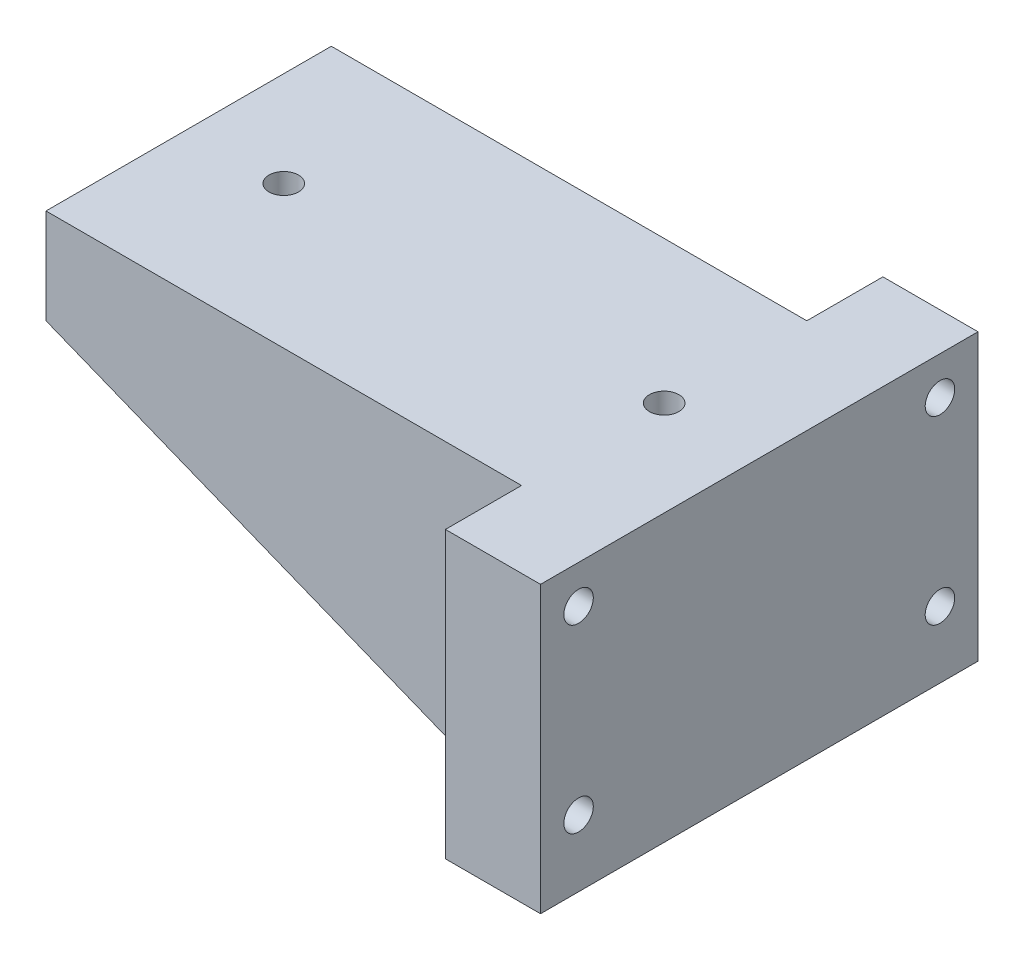
ISO-10303-21;
HEADER;
FILE_DESCRIPTION(('STEP AP214'),'2;1');
FILE_NAME('part.step','',(''),(''),'','','');
FILE_SCHEMA(('AUTOMOTIVE_DESIGN { 1 0 10303 214 1 1 1 1 }'));
ENDSEC;
DATA;
#1=APPLICATION_CONTEXT('core data for automotive mechanical design processes');
#2=APPLICATION_PROTOCOL_DEFINITION('international standard','automotive_design',2000,#1);
#3=PRODUCT_CONTEXT('',#1,'mechanical');
#4=PRODUCT('Part','Part','',(#3));
#5=PRODUCT_RELATED_PRODUCT_CATEGORY('part','',(#4));
#6=PRODUCT_DEFINITION_FORMATION('','',#4);
#7=PRODUCT_DEFINITION_CONTEXT('part definition',#1,'design');
#8=PRODUCT_DEFINITION('design','',#6,#7);
#9=PRODUCT_DEFINITION_SHAPE('','',#8);
#10=(LENGTH_UNIT() NAMED_UNIT(*) SI_UNIT(.MILLI.,.METRE.));
#11=(NAMED_UNIT(*) PLANE_ANGLE_UNIT() SI_UNIT($,.RADIAN.));
#12=(NAMED_UNIT(*) SI_UNIT($,.STERADIAN.) SOLID_ANGLE_UNIT());
#13=UNCERTAINTY_MEASURE_WITH_UNIT(LENGTH_MEASURE(1.E-05),#10,'distance_accuracy_value','');
#14=(GEOMETRIC_REPRESENTATION_CONTEXT(3) GLOBAL_UNCERTAINTY_ASSIGNED_CONTEXT((#13)) GLOBAL_UNIT_ASSIGNED_CONTEXT((#10,
#11,#12)) REPRESENTATION_CONTEXT('',''));
#15=CARTESIAN_POINT('',(0.,0.,0.));
#16=DIRECTION('',(0.,0.,1.));
#17=DIRECTION('',(1.,0.,0.));
#18=AXIS2_PLACEMENT_3D('',#15,#16,#17);
#19=CARTESIAN_POINT('',(0.,0.,0.));
#20=DIRECTION('',(0.,-1.,0.));
#21=DIRECTION('',(0.,0.,-1.));
#22=AXIS2_PLACEMENT_3D('',#19,#20,#21);
#23=PLANE('',#22);
#24=CARTESIAN_POINT('',(20.,0.,0.));
#25=DIRECTION('',(0.,1.,0.));
#26=DIRECTION('',(0.,0.,1.));
#27=AXIS2_PLACEMENT_3D('',#24,#25,#26);
#28=CIRCLE('',#27,1.55);
#29=CARTESIAN_POINT('',(20.,0.,1.55));
#30=VERTEX_POINT('',#29);
#31=EDGE_CURVE('E291',#30,#30,#28,.T.);
#32=ORIENTED_EDGE('',*,*,#31,.T.);
#33=EDGE_LOOP('',(#32));
#34=FACE_BOUND('',#33,.T.);
#35=CARTESIAN_POINT('',(-20.,0.,0.));
#36=DIRECTION('',(0.,1.,0.));
#37=DIRECTION('',(0.,0.,1.));
#38=AXIS2_PLACEMENT_3D('',#35,#36,#37);
#39=CIRCLE('',#38,1.55);
#40=CARTESIAN_POINT('',(-20.,0.,1.55));
#41=VERTEX_POINT('',#40);
#42=EDGE_CURVE('E280',#41,#41,#39,.T.);
#43=ORIENTED_EDGE('',*,*,#42,.T.);
#44=EDGE_LOOP('',(#43));
#45=FACE_BOUND('',#44,.T.);
#46=DIRECTION('',(0.,0.,-1.));
#47=VECTOR('',#46,1.);
#48=CARTESIAN_POINT('',(20.,0.,0.));
#49=LINE('',#48,#47);
#50=CARTESIAN_POINT('',(20.,0.,9.));
#51=VERTEX_POINT('',#50);
#52=CARTESIAN_POINT('',(20.,0.,5.));
#53=VERTEX_POINT('',#52);
#54=EDGE_CURVE('E261',#51,#53,#49,.T.);
#55=ORIENTED_EDGE('',*,*,#54,.F.);
#56=DIRECTION('',(-1.,0.,0.));
#57=VECTOR('',#56,1.);
#58=CARTESIAN_POINT('',(20.,0.,9.));
#59=LINE('',#58,#57);
#60=CARTESIAN_POINT('',(-30.,0.,9.));
#61=VERTEX_POINT('',#60);
#62=EDGE_CURVE('E151',#51,#61,#59,.T.);
#63=ORIENTED_EDGE('',*,*,#62,.T.);
#64=DIRECTION('',(0.,0.,1.));
#65=VECTOR('',#64,1.);
#66=CARTESIAN_POINT('',(-30.,0.,15.));
#67=LINE('',#66,#65);
#68=CARTESIAN_POINT('',(-30.,0.,-9.));
#69=VERTEX_POINT('',#68);
#70=EDGE_CURVE('E62',#69,#61,#67,.T.);
#71=ORIENTED_EDGE('',*,*,#70,.F.);
#72=DIRECTION('',(1.,0.,0.));
#73=VECTOR('',#72,1.);
#74=CARTESIAN_POINT('',(20.,0.,-9.));
#75=LINE('',#74,#73);
#76=CARTESIAN_POINT('',(20.,0.,-9.));
#77=VERTEX_POINT('',#76);
#78=EDGE_CURVE('E190',#69,#77,#75,.T.);
#79=ORIENTED_EDGE('',*,*,#78,.T.);
#80=DIRECTION('',(0.,0.,-1.));
#81=VECTOR('',#80,1.);
#82=CARTESIAN_POINT('',(20.,0.,0.));
#83=LINE('',#82,#81);
#84=CARTESIAN_POINT('',(20.,0.,-5.));
#85=VERTEX_POINT('',#84);
#86=EDGE_CURVE('E215',#85,#77,#83,.T.);
#87=ORIENTED_EDGE('',*,*,#86,.F.);
#88=DIRECTION('',(1.,0.,0.));
#89=VECTOR('',#88,1.);
#90=CARTESIAN_POINT('',(20.,0.,-5.));
#91=LINE('',#90,#89);
#92=CARTESIAN_POINT('',(24.,0.,-5.));
#93=VERTEX_POINT('',#92);
#94=EDGE_CURVE('E233',#85,#93,#91,.T.);
#95=ORIENTED_EDGE('',*,*,#94,.T.);
#96=DIRECTION('',(0.,0.,-1.));
#97=VECTOR('',#96,1.);
#98=CARTESIAN_POINT('',(24.,0.,0.));
#99=LINE('',#98,#97);
#100=CARTESIAN_POINT('',(24.,0.,5.));
#101=VERTEX_POINT('',#100);
#102=EDGE_CURVE('E199',#101,#93,#99,.T.);
#103=ORIENTED_EDGE('',*,*,#102,.F.);
#104=DIRECTION('',(1.,0.,0.));
#105=VECTOR('',#104,1.);
#106=CARTESIAN_POINT('',(20.,0.,5.));
#107=LINE('',#106,#105);
#108=EDGE_CURVE('E268',#53,#101,#107,.T.);
#109=ORIENTED_EDGE('',*,*,#108,.F.);
#110=EDGE_LOOP('',(#55,#63,#71,#79,#87,#95,#103,#109));
#111=FACE_BOUND('',#110,.T.);
#112=ADVANCED_FACE('F39',(#34,#45,#111),#23,.T.);
#113=CARTESIAN_POINT('',(20.,0.,0.));
#114=DIRECTION('',(1.,0.,0.));
#115=DIRECTION('',(0.,0.,-1.));
#116=AXIS2_PLACEMENT_3D('',#113,#114,#115);
#117=PLANE('',#116);
#118=DIRECTION('',(0.,1.,0.));
#119=VECTOR('',#118,1.);
#120=CARTESIAN_POINT('',(20.,-20.,9.));
#121=LINE('',#120,#119);
#122=CARTESIAN_POINT('',(20.,-20.,9.));
#123=VERTEX_POINT('',#122);
#124=EDGE_CURVE('E147',#123,#51,#121,.T.);
#125=ORIENTED_EDGE('',*,*,#124,.T.);
#126=ORIENTED_EDGE('',*,*,#54,.T.);
#127=DIRECTION('',(0.,-1.,0.));
#128=VECTOR('',#127,1.);
#129=CARTESIAN_POINT('',(20.,0.,5.));
#130=LINE('',#129,#128);
#131=CARTESIAN_POINT('',(20.,-20.,5.));
#132=VERTEX_POINT('',#131);
#133=EDGE_CURVE('E170',#53,#132,#130,.T.);
#134=ORIENTED_EDGE('',*,*,#133,.T.);
#135=DIRECTION('',(0.,0.,-1.));
#136=VECTOR('',#135,1.);
#137=CARTESIAN_POINT('',(20.,-20.,0.));
#138=LINE('',#137,#136);
#139=EDGE_CURVE('E167',#123,#132,#138,.T.);
#140=ORIENTED_EDGE('',*,*,#139,.F.);
#141=EDGE_LOOP('',(#125,#126,#134,#140));
#142=FACE_BOUND('',#141,.T.);
#143=ADVANCED_FACE('F168',(#142),#117,.F.);
#144=CARTESIAN_POINT('',(20.,0.,0.));
#145=DIRECTION('',(1.,0.,0.));
#146=DIRECTION('',(0.,0.,-1.));
#147=AXIS2_PLACEMENT_3D('',#144,#145,#146);
#148=PLANE('',#147);
#149=CARTESIAN_POINT('',(20.,6.,-19.));
#150=DIRECTION('',(1.,0.,0.));
#151=DIRECTION('',(0.,0.,-1.));
#152=AXIS2_PLACEMENT_3D('',#149,#150,#151);
#153=CIRCLE('',#152,1.55);
#154=CARTESIAN_POINT('',(20.,6.,-20.55));
#155=VERTEX_POINT('',#154);
#156=EDGE_CURVE('E211',#155,#155,#153,.T.);
#157=ORIENTED_EDGE('',*,*,#156,.T.);
#158=EDGE_LOOP('',(#157));
#159=FACE_BOUND('',#158,.T.);
#160=CARTESIAN_POINT('',(20.,-13.,-19.));
#161=DIRECTION('',(1.,0.,0.));
#162=DIRECTION('',(0.,0.,-1.));
#163=AXIS2_PLACEMENT_3D('',#160,#161,#162);
#164=CIRCLE('',#163,1.55);
#165=CARTESIAN_POINT('',(20.,-13.,-20.55));
#166=VERTEX_POINT('',#165);
#167=EDGE_CURVE('E208',#166,#166,#164,.T.);
#168=ORIENTED_EDGE('',*,*,#167,.T.);
#169=EDGE_LOOP('',(#168));
#170=FACE_BOUND('',#169,.T.);
#171=DIRECTION('',(0.,0.,-1.));
#172=VECTOR('',#171,1.);
#173=CARTESIAN_POINT('',(20.,-20.,0.));
#174=LINE('',#173,#172);
#175=CARTESIAN_POINT('',(20.,-20.,-15.));
#176=VERTEX_POINT('',#175);
#177=CARTESIAN_POINT('',(20.,-20.,-23.));
#178=VERTEX_POINT('',#177);
#179=EDGE_CURVE('E221',#176,#178,#174,.T.);
#180=ORIENTED_EDGE('',*,*,#179,.F.);
#181=DIRECTION('',(0.,1.,0.));
#182=VECTOR('',#181,1.);
#183=CARTESIAN_POINT('',(20.,0.,-15.));
#184=LINE('',#183,#182);
#185=CARTESIAN_POINT('',(20.,10.,-15.));
#186=VERTEX_POINT('',#185);
#187=EDGE_CURVE('E230',#176,#186,#184,.T.);
#188=ORIENTED_EDGE('',*,*,#187,.T.);
#189=DIRECTION('',(0.,0.,-1.));
#190=VECTOR('',#189,1.);
#191=CARTESIAN_POINT('',(20.,10.,0.));
#192=LINE('',#191,#190);
#193=CARTESIAN_POINT('',(20.,10.,-23.));
#194=VERTEX_POINT('',#193);
#195=EDGE_CURVE('E228',#186,#194,#192,.T.);
#196=ORIENTED_EDGE('',*,*,#195,.T.);
#197=DIRECTION('',(0.,-1.,0.));
#198=VECTOR('',#197,1.);
#199=CARTESIAN_POINT('',(20.,0.,-23.));
#200=LINE('',#199,#198);
#201=EDGE_CURVE('E225',#194,#178,#200,.T.);
#202=ORIENTED_EDGE('',*,*,#201,.T.);
#203=EDGE_LOOP('',(#180,#188,#196,#202));
#204=FACE_BOUND('',#203,.T.);
#205=ADVANCED_FACE('F353',(#159,#170,#204),#148,.F.);
#206=CARTESIAN_POINT('',(20.,0.,5.));
#207=DIRECTION('',(0.,0.,1.));
#208=DIRECTION('',(0.,-1.,0.));
#209=AXIS2_PLACEMENT_3D('',#206,#207,#208);
#210=PLANE('',#209);
#211=DIRECTION('',(0.,-1.,0.));
#212=VECTOR('',#211,1.);
#213=CARTESIAN_POINT('',(24.,0.,5.));
#214=LINE('',#213,#212);
#215=CARTESIAN_POINT('',(24.,-20.,5.));
#216=VERTEX_POINT('',#215);
#217=EDGE_CURVE('E201',#101,#216,#214,.T.);
#218=ORIENTED_EDGE('',*,*,#217,.T.);
#219=DIRECTION('',(1.,0.,0.));
#220=VECTOR('',#219,1.);
#221=CARTESIAN_POINT('',(20.,-20.,5.));
#222=LINE('',#221,#220);
#223=EDGE_CURVE('E278',#132,#216,#222,.T.);
#224=ORIENTED_EDGE('',*,*,#223,.F.);
#225=ORIENTED_EDGE('',*,*,#133,.F.);
#226=ORIENTED_EDGE('',*,*,#108,.T.);
#227=EDGE_LOOP('',(#218,#224,#225,#226));
#228=FACE_BOUND('',#227,.T.);
#229=ADVANCED_FACE('F340',(#228),#210,.F.);
#230=CARTESIAN_POINT('',(20.,0.,-5.));
#231=DIRECTION('',(0.,0.,1.));
#232=DIRECTION('',(0.,-1.,0.));
#233=AXIS2_PLACEMENT_3D('',#230,#231,#232);
#234=PLANE('',#233);
#235=DIRECTION('',(1.,0.,0.));
#236=VECTOR('',#235,1.);
#237=CARTESIAN_POINT('',(20.,-20.,-5.));
#238=LINE('',#237,#236);
#239=CARTESIAN_POINT('',(20.,-20.,-5.));
#240=VERTEX_POINT('',#239);
#241=CARTESIAN_POINT('',(24.,-20.,-5.));
#242=VERTEX_POINT('',#241);
#243=EDGE_CURVE('E248',#240,#242,#238,.T.);
#244=ORIENTED_EDGE('',*,*,#243,.T.);
#245=DIRECTION('',(0.,-1.,0.));
#246=VECTOR('',#245,1.);
#247=CARTESIAN_POINT('',(24.,0.,-5.));
#248=LINE('',#247,#246);
#249=EDGE_CURVE('E197',#93,#242,#248,.T.);
#250=ORIENTED_EDGE('',*,*,#249,.F.);
#251=ORIENTED_EDGE('',*,*,#94,.F.);
#252=DIRECTION('',(0.,-1.,0.));
#253=VECTOR('',#252,1.);
#254=CARTESIAN_POINT('',(20.,0.,-5.));
#255=LINE('',#254,#253);
#256=EDGE_CURVE('E218',#85,#240,#255,.T.);
#257=ORIENTED_EDGE('',*,*,#256,.T.);
#258=EDGE_LOOP('',(#244,#250,#251,#257));
#259=FACE_BOUND('',#258,.T.);
#260=ADVANCED_FACE('F334',(#259),#234,.T.);
#261=CARTESIAN_POINT('',(-30.,10.,-15.));
#262=DIRECTION('',(0.,0.,1.));
#263=DIRECTION('',(1.,0.,0.));
#264=AXIS2_PLACEMENT_3D('',#261,#262,#263);
#265=PLANE('',#264);
#266=ORIENTED_EDGE('',*,*,#187,.F.);
#267=DIRECTION('',(-0.928476690885259,0.371390676354104,0.));
#268=VECTOR('',#267,1.);
#269=CARTESIAN_POINT('',(20.,-20.,-15.));
#270=LINE('',#269,#268);
#271=CARTESIAN_POINT('',(-30.,0.,-15.));
#272=VERTEX_POINT('',#271);
#273=EDGE_CURVE('E180',#176,#272,#270,.T.);
#274=ORIENTED_EDGE('',*,*,#273,.T.);
#275=DIRECTION('',(0.,-1.,0.));
#276=VECTOR('',#275,1.);
#277=CARTESIAN_POINT('',(-30.,10.,-15.));
#278=LINE('',#277,#276);
#279=CARTESIAN_POINT('',(-30.,10.,-15.));
#280=VERTEX_POINT('',#279);
#281=EDGE_CURVE('E11',#280,#272,#278,.T.);
#282=ORIENTED_EDGE('',*,*,#281,.F.);
#283=DIRECTION('',(-1.,0.,0.));
#284=VECTOR('',#283,1.);
#285=CARTESIAN_POINT('',(-30.,10.,-15.));
#286=LINE('',#285,#284);
#287=EDGE_CURVE('E301',#186,#280,#286,.T.);
#288=ORIENTED_EDGE('',*,*,#287,.F.);
#289=EDGE_LOOP('',(#266,#274,#282,#288));
#290=FACE_BOUND('',#289,.T.);
#291=ADVANCED_FACE('F370',(#290),#265,.F.);
#292=CARTESIAN_POINT('',(-30.,10.,15.));
#293=DIRECTION('',(0.,0.,-1.));
#294=DIRECTION('',(-1.,0.,0.));
#295=AXIS2_PLACEMENT_3D('',#292,#293,#294);
#296=PLANE('',#295);
#297=DIRECTION('',(0.,-1.,0.));
#298=VECTOR('',#297,1.);
#299=CARTESIAN_POINT('',(20.,0.,15.));
#300=LINE('',#299,#298);
#301=CARTESIAN_POINT('',(20.,10.,15.));
#302=VERTEX_POINT('',#301);
#303=CARTESIAN_POINT('',(20.,-20.,15.));
#304=VERTEX_POINT('',#303);
#305=EDGE_CURVE('E54',#302,#304,#300,.T.);
#306=ORIENTED_EDGE('',*,*,#305,.F.);
#307=DIRECTION('',(1.,0.,0.));
#308=VECTOR('',#307,1.);
#309=CARTESIAN_POINT('',(-30.,10.,15.));
#310=LINE('',#309,#308);
#311=CARTESIAN_POINT('',(-30.,10.,15.));
#312=VERTEX_POINT('',#311);
#313=EDGE_CURVE('E306',#312,#302,#310,.T.);
#314=ORIENTED_EDGE('',*,*,#313,.F.);
#315=DIRECTION('',(0.,-1.,0.));
#316=VECTOR('',#315,1.);
#317=CARTESIAN_POINT('',(-30.,10.,15.));
#318=LINE('',#317,#316);
#319=CARTESIAN_POINT('',(-30.,0.,15.));
#320=VERTEX_POINT('',#319);
#321=EDGE_CURVE('E47',#312,#320,#318,.T.);
#322=ORIENTED_EDGE('',*,*,#321,.T.);
#323=DIRECTION('',(0.928476690885259,-0.371390676354104,0.));
#324=VECTOR('',#323,1.);
#325=CARTESIAN_POINT('',(-30.,0.,15.));
#326=LINE('',#325,#324);
#327=EDGE_CURVE('E164',#320,#304,#326,.T.);
#328=ORIENTED_EDGE('',*,*,#327,.T.);
#329=EDGE_LOOP('',(#306,#314,#322,#328));
#330=FACE_BOUND('',#329,.T.);
#331=ADVANCED_FACE('F313',(#330),#296,.F.);
#332=CARTESIAN_POINT('',(0.,10.,0.));
#333=DIRECTION('',(0.,-1.,0.));
#334=DIRECTION('',(0.,0.,-1.));
#335=AXIS2_PLACEMENT_3D('',#332,#333,#334);
#336=PLANE('',#335);
#337=DIRECTION('',(0.,0.,-1.));
#338=VECTOR('',#337,1.);
#339=CARTESIAN_POINT('',(30.,10.,15.));
#340=LINE('',#339,#338);
#341=CARTESIAN_POINT('',(30.,10.,23.));
#342=VERTEX_POINT('',#341);
#343=CARTESIAN_POINT('',(30.,10.,-23.));
#344=VERTEX_POINT('',#343);
#345=EDGE_CURVE('E299',#342,#344,#340,.T.);
#346=ORIENTED_EDGE('',*,*,#345,.T.);
#347=DIRECTION('',(1.,0.,0.));
#348=VECTOR('',#347,1.);
#349=CARTESIAN_POINT('',(20.,10.,-23.));
#350=LINE('',#349,#348);
#351=EDGE_CURVE('E241',#194,#344,#350,.T.);
#352=ORIENTED_EDGE('',*,*,#351,.F.);
#353=ORIENTED_EDGE('',*,*,#195,.F.);
#354=ORIENTED_EDGE('',*,*,#287,.T.);
#355=DIRECTION('',(0.,0.,1.));
#356=VECTOR('',#355,1.);
#357=CARTESIAN_POINT('',(-30.,10.,15.));
#358=LINE('',#357,#356);
#359=EDGE_CURVE('E304',#280,#312,#358,.T.);
#360=ORIENTED_EDGE('',*,*,#359,.T.);
#361=ORIENTED_EDGE('',*,*,#313,.T.);
#362=DIRECTION('',(0.,0.,-1.));
#363=VECTOR('',#362,1.);
#364=CARTESIAN_POINT('',(20.,10.,0.));
#365=LINE('',#364,#363);
#366=CARTESIAN_POINT('',(20.,10.,23.));
#367=VERTEX_POINT('',#366);
#368=EDGE_CURVE('E264',#367,#302,#365,.T.);
#369=ORIENTED_EDGE('',*,*,#368,.F.);
#370=DIRECTION('',(1.,0.,0.));
#371=VECTOR('',#370,1.);
#372=CARTESIAN_POINT('',(20.,10.,23.));
#373=LINE('',#372,#371);
#374=EDGE_CURVE('E283',#367,#342,#373,.T.);
#375=ORIENTED_EDGE('',*,*,#374,.T.);
#376=EDGE_LOOP('',(#346,#352,#353,#354,#360,#361,#369,#375));
#377=FACE_BOUND('',#376,.T.);
#378=CARTESIAN_POINT('',(20.,10.,0.));
#379=DIRECTION('',(0.,1.,0.));
#380=DIRECTION('',(0.,0.,1.));
#381=AXIS2_PLACEMENT_3D('',#378,#379,#380);
#382=CIRCLE('',#381,1.55);
#383=CARTESIAN_POINT('',(20.,10.,1.55));
#384=VERTEX_POINT('',#383);
#385=EDGE_CURVE('E294',#384,#384,#382,.T.);
#386=ORIENTED_EDGE('',*,*,#385,.F.);
#387=EDGE_LOOP('',(#386));
#388=FACE_BOUND('',#387,.T.);
#389=CARTESIAN_POINT('',(-20.,10.,0.));
#390=DIRECTION('',(0.,1.,0.));
#391=DIRECTION('',(0.,0.,1.));
#392=AXIS2_PLACEMENT_3D('',#389,#390,#391);
#393=CIRCLE('',#392,1.55);
#394=CARTESIAN_POINT('',(-20.,10.,1.55));
#395=VERTEX_POINT('',#394);
#396=EDGE_CURVE('E288',#395,#395,#393,.T.);
#397=ORIENTED_EDGE('',*,*,#396,.F.);
#398=EDGE_LOOP('',(#397));
#399=FACE_BOUND('',#398,.T.);
#400=ADVANCED_FACE('F366',(#377,#388,#399),#336,.F.);
#401=CARTESIAN_POINT('',(30.,10.,15.));
#402=DIRECTION('',(-1.,0.,0.));
#403=DIRECTION('',(0.,0.,1.));
#404=AXIS2_PLACEMENT_3D('',#401,#402,#403);
#405=PLANE('',#404);
#406=DIRECTION('',(0.,0.,-1.));
#407=VECTOR('',#406,1.);
#408=CARTESIAN_POINT('',(30.,-20.,0.));
#409=LINE('',#408,#407);
#410=CARTESIAN_POINT('',(30.,-20.,23.));
#411=VERTEX_POINT('',#410);
#412=CARTESIAN_POINT('',(30.,-20.,-23.));
#413=VERTEX_POINT('',#412);
#414=EDGE_CURVE('E257',#411,#413,#409,.T.);
#415=ORIENTED_EDGE('',*,*,#414,.T.);
#416=DIRECTION('',(0.,-1.,0.));
#417=VECTOR('',#416,1.);
#418=CARTESIAN_POINT('',(30.,0.,-23.));
#419=LINE('',#418,#417);
#420=EDGE_CURVE('E212',#344,#413,#419,.T.);
#421=ORIENTED_EDGE('',*,*,#420,.F.);
#422=ORIENTED_EDGE('',*,*,#345,.F.);
#423=DIRECTION('',(0.,-1.,0.));
#424=VECTOR('',#423,1.);
#425=CARTESIAN_POINT('',(30.,0.,23.));
#426=LINE('',#425,#424);
#427=EDGE_CURVE('E274',#342,#411,#426,.T.);
#428=ORIENTED_EDGE('',*,*,#427,.T.);
#429=EDGE_LOOP('',(#415,#421,#422,#428));
#430=FACE_BOUND('',#429,.T.);
#431=CARTESIAN_POINT('',(30.,-13.,19.));
#432=DIRECTION('',(1.,0.,0.));
#433=DIRECTION('',(0.,0.,-1.));
#434=AXIS2_PLACEMENT_3D('',#431,#432,#433);
#435=CIRCLE('',#434,1.55);
#436=CARTESIAN_POINT('',(30.,-13.,17.45));
#437=VERTEX_POINT('',#436);
#438=EDGE_CURVE('E244',#437,#437,#435,.T.);
#439=ORIENTED_EDGE('',*,*,#438,.F.);
#440=EDGE_LOOP('',(#439));
#441=FACE_BOUND('',#440,.T.);
#442=CARTESIAN_POINT('',(30.,6.,19.));
#443=DIRECTION('',(1.,0.,0.));
#444=DIRECTION('',(0.,0.,-1.));
#445=AXIS2_PLACEMENT_3D('',#442,#443,#444);
#446=CIRCLE('',#445,1.55);
#447=CARTESIAN_POINT('',(30.,6.,17.45));
#448=VERTEX_POINT('',#447);
#449=EDGE_CURVE('E271',#448,#448,#446,.T.);
#450=ORIENTED_EDGE('',*,*,#449,.F.);
#451=EDGE_LOOP('',(#450));
#452=FACE_BOUND('',#451,.T.);
#453=CARTESIAN_POINT('',(30.,-13.,-19.));
#454=DIRECTION('',(1.,0.,0.));
#455=DIRECTION('',(0.,0.,-1.));
#456=AXIS2_PLACEMENT_3D('',#453,#454,#455);
#457=CIRCLE('',#456,1.55);
#458=CARTESIAN_POINT('',(30.,-13.,-20.55));
#459=VERTEX_POINT('',#458);
#460=EDGE_CURVE('E207',#459,#459,#457,.T.);
#461=ORIENTED_EDGE('',*,*,#460,.F.);
#462=EDGE_LOOP('',(#461));
#463=FACE_BOUND('',#462,.T.);
#464=CARTESIAN_POINT('',(30.,6.,-19.));
#465=DIRECTION('',(1.,0.,0.));
#466=DIRECTION('',(0.,0.,-1.));
#467=AXIS2_PLACEMENT_3D('',#464,#465,#466);
#468=CIRCLE('',#467,1.55);
#469=CARTESIAN_POINT('',(30.,6.,-20.55));
#470=VERTEX_POINT('',#469);
#471=EDGE_CURVE('E236',#470,#470,#468,.T.);
#472=ORIENTED_EDGE('',*,*,#471,.F.);
#473=EDGE_LOOP('',(#472));
#474=FACE_BOUND('',#473,.T.);
#475=ADVANCED_FACE('F41',(#430,#441,#452,#463,#474),#405,.F.);
#476=CARTESIAN_POINT('',(-30.,10.,15.));
#477=DIRECTION('',(1.,0.,0.));
#478=DIRECTION('',(0.,0.,-1.));
#479=AXIS2_PLACEMENT_3D('',#476,#477,#478);
#480=PLANE('',#479);
#481=EDGE_CURVE('E302',#272,#69,#67,.T.);
#482=ORIENTED_EDGE('',*,*,#481,.T.);
#483=ORIENTED_EDGE('',*,*,#70,.T.);
#484=DIRECTION('',(0.,0.,1.));
#485=VECTOR('',#484,1.);
#486=CARTESIAN_POINT('',(-30.,0.,9.));
#487=LINE('',#486,#485);
#488=EDGE_CURVE('E163',#61,#320,#487,.T.);
#489=ORIENTED_EDGE('',*,*,#488,.T.);
#490=ORIENTED_EDGE('',*,*,#321,.F.);
#491=ORIENTED_EDGE('',*,*,#359,.F.);
#492=ORIENTED_EDGE('',*,*,#281,.T.);
#493=EDGE_LOOP('',(#482,#483,#489,#490,#491,#492));
#494=FACE_BOUND('',#493,.T.);
#495=ADVANCED_FACE('F316',(#494),#480,.F.);
#496=CARTESIAN_POINT('',(20.,10.,0.));
#497=DIRECTION('',(0.,-1.,0.));
#498=DIRECTION('',(0.,0.,-1.));
#499=AXIS2_PLACEMENT_3D('',#496,#497,#498);
#500=CYLINDRICAL_SURFACE('',#499,1.55);
#501=ORIENTED_EDGE('',*,*,#385,.T.);
#502=EDGE_LOOP('',(#501));
#503=FACE_BOUND('',#502,.T.);
#504=ORIENTED_EDGE('',*,*,#31,.F.);
#505=EDGE_LOOP('',(#504));
#506=FACE_BOUND('',#505,.T.);
#507=ADVANCED_FACE('F372',(#503,#506),#500,.F.);
#508=CARTESIAN_POINT('',(-20.,10.,0.));
#509=DIRECTION('',(0.,-1.,0.));
#510=DIRECTION('',(0.,0.,-1.));
#511=AXIS2_PLACEMENT_3D('',#508,#509,#510);
#512=CYLINDRICAL_SURFACE('',#511,1.55);
#513=ORIENTED_EDGE('',*,*,#396,.T.);
#514=EDGE_LOOP('',(#513));
#515=FACE_BOUND('',#514,.T.);
#516=ORIENTED_EDGE('',*,*,#42,.F.);
#517=EDGE_LOOP('',(#516));
#518=FACE_BOUND('',#517,.T.);
#519=ADVANCED_FACE('F414',(#515,#518),#512,.F.);
#520=CARTESIAN_POINT('',(20.,-20.,0.));
#521=DIRECTION('',(0.,-1.,0.));
#522=DIRECTION('',(0.,0.,-1.));
#523=AXIS2_PLACEMENT_3D('',#520,#521,#522);
#524=PLANE('',#523);
#525=ORIENTED_EDGE('',*,*,#414,.F.);
#526=DIRECTION('',(1.,0.,0.));
#527=VECTOR('',#526,1.);
#528=CARTESIAN_POINT('',(20.,-20.,23.));
#529=LINE('',#528,#527);
#530=CARTESIAN_POINT('',(20.,-20.,23.));
#531=VERTEX_POINT('',#530);
#532=EDGE_CURVE('E281',#531,#411,#529,.T.);
#533=ORIENTED_EDGE('',*,*,#532,.F.);
#534=EDGE_CURVE('E174',#531,#304,#138,.T.);
#535=ORIENTED_EDGE('',*,*,#534,.T.);
#536=DIRECTION('',(0.,0.,1.));
#537=VECTOR('',#536,1.);
#538=CARTESIAN_POINT('',(20.,-20.,9.));
#539=LINE('',#538,#537);
#540=EDGE_CURVE('E160',#123,#304,#539,.T.);
#541=ORIENTED_EDGE('',*,*,#540,.F.);
#542=ORIENTED_EDGE('',*,*,#139,.T.);
#543=ORIENTED_EDGE('',*,*,#223,.T.);
#544=DIRECTION('',(0.,0.,-1.));
#545=VECTOR('',#544,1.);
#546=CARTESIAN_POINT('',(24.,-20.,0.));
#547=LINE('',#546,#545);
#548=EDGE_CURVE('E204',#216,#242,#547,.T.);
#549=ORIENTED_EDGE('',*,*,#548,.T.);
#550=ORIENTED_EDGE('',*,*,#243,.F.);
#551=CARTESIAN_POINT('',(20.,-20.,-9.));
#552=VERTEX_POINT('',#551);
#553=EDGE_CURVE('E222',#240,#552,#174,.T.);
#554=ORIENTED_EDGE('',*,*,#553,.T.);
#555=DIRECTION('',(0.,0.,-1.));
#556=VECTOR('',#555,1.);
#557=CARTESIAN_POINT('',(20.,-20.,-9.));
#558=LINE('',#557,#556);
#559=EDGE_CURVE('E192',#552,#176,#558,.T.);
#560=ORIENTED_EDGE('',*,*,#559,.T.);
#561=ORIENTED_EDGE('',*,*,#179,.T.);
#562=DIRECTION('',(1.,0.,0.));
#563=VECTOR('',#562,1.);
#564=CARTESIAN_POINT('',(20.,-20.,-23.));
#565=LINE('',#564,#563);
#566=EDGE_CURVE('E245',#178,#413,#565,.T.);
#567=ORIENTED_EDGE('',*,*,#566,.T.);
#568=EDGE_LOOP('',(#525,#533,#535,#541,#542,#543,#549,#550,#554,#560,#561,#567));
#569=FACE_BOUND('',#568,.T.);
#570=ADVANCED_FACE('F178',(#569),#524,.T.);
#571=CARTESIAN_POINT('',(20.,0.,23.));
#572=DIRECTION('',(0.,0.,1.));
#573=DIRECTION('',(0.,-1.,0.));
#574=AXIS2_PLACEMENT_3D('',#571,#572,#573);
#575=PLANE('',#574);
#576=ORIENTED_EDGE('',*,*,#427,.F.);
#577=ORIENTED_EDGE('',*,*,#374,.F.);
#578=DIRECTION('',(0.,-1.,0.));
#579=VECTOR('',#578,1.);
#580=CARTESIAN_POINT('',(20.,0.,23.));
#581=LINE('',#580,#579);
#582=EDGE_CURVE('E175',#367,#531,#581,.T.);
#583=ORIENTED_EDGE('',*,*,#582,.T.);
#584=ORIENTED_EDGE('',*,*,#532,.T.);
#585=EDGE_LOOP('',(#576,#577,#583,#584));
#586=FACE_BOUND('',#585,.T.);
#587=ADVANCED_FACE('F392',(#586),#575,.T.);
#588=CARTESIAN_POINT('',(20.,6.,19.));
#589=DIRECTION('',(1.,0.,0.));
#590=DIRECTION('',(0.,0.,-1.));
#591=AXIS2_PLACEMENT_3D('',#588,#589,#590);
#592=CYLINDRICAL_SURFACE('',#591,1.55);
#593=CARTESIAN_POINT('',(20.,6.,19.));
#594=DIRECTION('',(1.,0.,0.));
#595=DIRECTION('',(0.,0.,-1.));
#596=AXIS2_PLACEMENT_3D('',#593,#594,#595);
#597=CIRCLE('',#596,1.55);
#598=CARTESIAN_POINT('',(20.,6.,17.45));
#599=VERTEX_POINT('',#598);
#600=EDGE_CURVE('E256',#599,#599,#597,.T.);
#601=ORIENTED_EDGE('',*,*,#600,.F.);
#602=EDGE_LOOP('',(#601));
#603=FACE_BOUND('',#602,.T.);
#604=ORIENTED_EDGE('',*,*,#449,.T.);
#605=EDGE_LOOP('',(#604));
#606=FACE_BOUND('',#605,.T.);
#607=ADVANCED_FACE('F406',(#603,#606),#592,.F.);
#608=CARTESIAN_POINT('',(20.,-13.,19.));
#609=DIRECTION('',(1.,0.,0.));
#610=DIRECTION('',(0.,0.,-1.));
#611=AXIS2_PLACEMENT_3D('',#608,#609,#610);
#612=CYLINDRICAL_SURFACE('',#611,1.55);
#613=CARTESIAN_POINT('',(20.,-13.,19.));
#614=DIRECTION('',(1.,0.,0.));
#615=DIRECTION('',(0.,0.,-1.));
#616=AXIS2_PLACEMENT_3D('',#613,#614,#615);
#617=CIRCLE('',#616,1.55);
#618=CARTESIAN_POINT('',(20.,-13.,17.45));
#619=VERTEX_POINT('',#618);
#620=EDGE_CURVE('E253',#619,#619,#617,.T.);
#621=ORIENTED_EDGE('',*,*,#620,.F.);
#622=EDGE_LOOP('',(#621));
#623=FACE_BOUND('',#622,.T.);
#624=ORIENTED_EDGE('',*,*,#438,.T.);
#625=EDGE_LOOP('',(#624));
#626=FACE_BOUND('',#625,.T.);
#627=ADVANCED_FACE('F396',(#623,#626),#612,.F.);
#628=ORIENTED_EDGE('',*,*,#620,.T.);
#629=EDGE_LOOP('',(#628));
#630=FACE_BOUND('',#629,.T.);
#631=ORIENTED_EDGE('',*,*,#600,.T.);
#632=EDGE_LOOP('',(#631));
#633=FACE_BOUND('',#632,.T.);
#634=ORIENTED_EDGE('',*,*,#305,.T.);
#635=ORIENTED_EDGE('',*,*,#534,.F.);
#636=ORIENTED_EDGE('',*,*,#582,.F.);
#637=ORIENTED_EDGE('',*,*,#368,.T.);
#638=EDGE_LOOP('',(#634,#635,#636,#637));
#639=FACE_BOUND('',#638,.T.);
#640=ADVANCED_FACE('F362',(#630,#633,#639),#117,.F.);
#641=CARTESIAN_POINT('',(20.,0.,-23.));
#642=DIRECTION('',(0.,0.,1.));
#643=DIRECTION('',(0.,-1.,0.));
#644=AXIS2_PLACEMENT_3D('',#641,#642,#643);
#645=PLANE('',#644);
#646=ORIENTED_EDGE('',*,*,#420,.T.);
#647=ORIENTED_EDGE('',*,*,#566,.F.);
#648=ORIENTED_EDGE('',*,*,#201,.F.);
#649=ORIENTED_EDGE('',*,*,#351,.T.);
#650=EDGE_LOOP('',(#646,#647,#648,#649));
#651=FACE_BOUND('',#650,.T.);
#652=ADVANCED_FACE('F386',(#651),#645,.F.);
#653=CARTESIAN_POINT('',(20.,6.,-19.));
#654=DIRECTION('',(1.,0.,0.));
#655=DIRECTION('',(0.,0.,-1.));
#656=AXIS2_PLACEMENT_3D('',#653,#654,#655);
#657=CYLINDRICAL_SURFACE('',#656,1.55);
#658=ORIENTED_EDGE('',*,*,#156,.F.);
#659=EDGE_LOOP('',(#658));
#660=FACE_BOUND('',#659,.T.);
#661=ORIENTED_EDGE('',*,*,#471,.T.);
#662=EDGE_LOOP('',(#661));
#663=FACE_BOUND('',#662,.T.);
#664=ADVANCED_FACE('F403',(#660,#663),#657,.F.);
#665=CARTESIAN_POINT('',(20.,-13.,-19.));
#666=DIRECTION('',(1.,0.,0.));
#667=DIRECTION('',(0.,0.,-1.));
#668=AXIS2_PLACEMENT_3D('',#665,#666,#667);
#669=CYLINDRICAL_SURFACE('',#668,1.55);
#670=ORIENTED_EDGE('',*,*,#167,.F.);
#671=EDGE_LOOP('',(#670));
#672=FACE_BOUND('',#671,.T.);
#673=ORIENTED_EDGE('',*,*,#460,.T.);
#674=EDGE_LOOP('',(#673));
#675=FACE_BOUND('',#674,.T.);
#676=ADVANCED_FACE('F351',(#672,#675),#669,.F.);
#677=ORIENTED_EDGE('',*,*,#86,.T.);
#678=DIRECTION('',(0.,-1.,0.));
#679=VECTOR('',#678,1.);
#680=CARTESIAN_POINT('',(20.,-20.,-9.));
#681=LINE('',#680,#679);
#682=EDGE_CURVE('E185',#77,#552,#681,.T.);
#683=ORIENTED_EDGE('',*,*,#682,.T.);
#684=ORIENTED_EDGE('',*,*,#553,.F.);
#685=ORIENTED_EDGE('',*,*,#256,.F.);
#686=EDGE_LOOP('',(#677,#683,#684,#685));
#687=FACE_BOUND('',#686,.T.);
#688=ADVANCED_FACE('F331',(#687),#148,.F.);
#689=CARTESIAN_POINT('',(24.,0.,0.));
#690=DIRECTION('',(1.,0.,0.));
#691=DIRECTION('',(0.,0.,-1.));
#692=AXIS2_PLACEMENT_3D('',#689,#690,#691);
#693=PLANE('',#692);
#694=ORIENTED_EDGE('',*,*,#249,.T.);
#695=ORIENTED_EDGE('',*,*,#548,.F.);
#696=ORIENTED_EDGE('',*,*,#217,.F.);
#697=ORIENTED_EDGE('',*,*,#102,.T.);
#698=EDGE_LOOP('',(#694,#695,#696,#697));
#699=FACE_BOUND('',#698,.T.);
#700=ADVANCED_FACE('F341',(#699),#693,.F.);
#701=CARTESIAN_POINT('',(20.,-20.,-9.));
#702=DIRECTION('',(-0.371390676354104,-0.928476690885259,0.));
#703=DIRECTION('',(0.928476690885259,-0.371390676354104,0.));
#704=AXIS2_PLACEMENT_3D('',#701,#702,#703);
#705=PLANE('',#704);
#706=ORIENTED_EDGE('',*,*,#273,.F.);
#707=ORIENTED_EDGE('',*,*,#559,.F.);
#708=DIRECTION('',(-0.928476690885259,0.371390676354104,0.));
#709=VECTOR('',#708,1.);
#710=CARTESIAN_POINT('',(20.,-20.,-9.));
#711=LINE('',#710,#709);
#712=EDGE_CURVE('E187',#552,#69,#711,.T.);
#713=ORIENTED_EDGE('',*,*,#712,.T.);
#714=ORIENTED_EDGE('',*,*,#481,.F.);
#715=EDGE_LOOP('',(#706,#707,#713,#714));
#716=FACE_BOUND('',#715,.T.);
#717=ADVANCED_FACE('F324',(#716),#705,.T.);
#718=CARTESIAN_POINT('',(0.,0.,-9.));
#719=DIRECTION('',(0.,0.,1.));
#720=DIRECTION('',(1.,0.,0.));
#721=AXIS2_PLACEMENT_3D('',#718,#719,#720);
#722=PLANE('',#721);
#723=ORIENTED_EDGE('',*,*,#682,.F.);
#724=ORIENTED_EDGE('',*,*,#78,.F.);
#725=ORIENTED_EDGE('',*,*,#712,.F.);
#726=EDGE_LOOP('',(#723,#724,#725));
#727=FACE_BOUND('',#726,.T.);
#728=ADVANCED_FACE('F327',(#727),#722,.T.);
#729=CARTESIAN_POINT('',(-30.,0.,9.));
#730=DIRECTION('',(-0.371390676354104,-0.928476690885259,0.));
#731=DIRECTION('',(0.928476690885259,-0.371390676354104,0.));
#732=AXIS2_PLACEMENT_3D('',#729,#730,#731);
#733=PLANE('',#732);
#734=ORIENTED_EDGE('',*,*,#327,.F.);
#735=ORIENTED_EDGE('',*,*,#488,.F.);
#736=DIRECTION('',(0.928476690885259,-0.371390676354104,0.));
#737=VECTOR('',#736,1.);
#738=CARTESIAN_POINT('',(-30.,0.,9.));
#739=LINE('',#738,#737);
#740=EDGE_CURVE('E150',#61,#123,#739,.T.);
#741=ORIENTED_EDGE('',*,*,#740,.T.);
#742=ORIENTED_EDGE('',*,*,#540,.T.);
#743=EDGE_LOOP('',(#734,#735,#741,#742));
#744=FACE_BOUND('',#743,.T.);
#745=ADVANCED_FACE('F158',(#744),#733,.T.);
#746=CARTESIAN_POINT('',(0.,0.,9.));
#747=DIRECTION('',(0.,0.,1.));
#748=DIRECTION('',(1.,0.,0.));
#749=AXIS2_PLACEMENT_3D('',#746,#747,#748);
#750=PLANE('',#749);
#751=ORIENTED_EDGE('',*,*,#740,.F.);
#752=ORIENTED_EDGE('',*,*,#62,.F.);
#753=ORIENTED_EDGE('',*,*,#124,.F.);
#754=EDGE_LOOP('',(#751,#752,#753));
#755=FACE_BOUND('',#754,.T.);
#756=ADVANCED_FACE('F149',(#755),#750,.F.);
#757=CLOSED_SHELL('',(#112,#143,#205,#229,#260,#291,#331,#400,#475,#495,#507,#519,#570,#587,
#607,#627,#640,#652,#664,#676,#688,#700,#717,#728,#745,#756));
#758=MANIFOLD_SOLID_BREP('B2',#757);
#759=ADVANCED_BREP_SHAPE_REPRESENTATION('',(#18,#758),#14);
#760=SHAPE_DEFINITION_REPRESENTATION(#9,#759);
ENDSEC;
END-ISO-10303-21;
